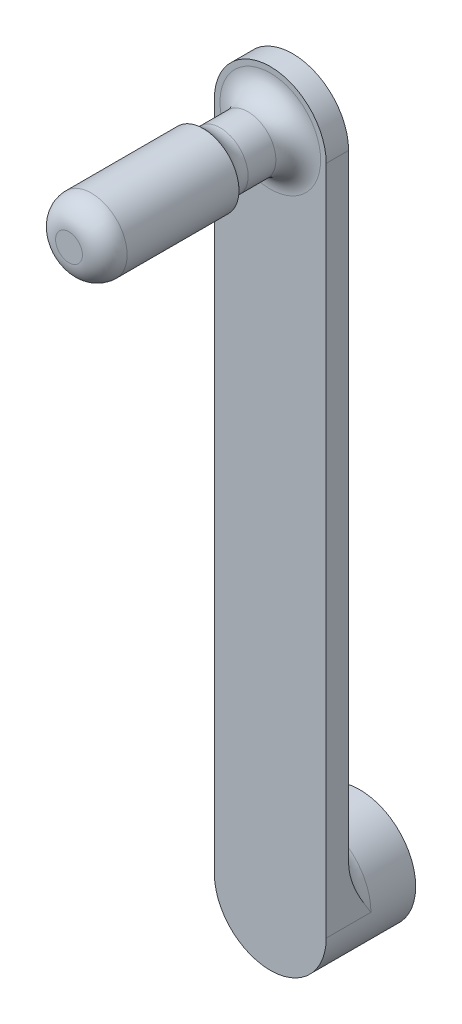
ISO-10303-21;
HEADER;
FILE_DESCRIPTION(('STEP AP214'),'2;1');
FILE_NAME('part.step','',(''),(''),'','','');
FILE_SCHEMA(('AUTOMOTIVE_DESIGN { 1 0 10303 214 1 1 1 1 }'));
ENDSEC;
DATA;
#1=APPLICATION_CONTEXT('core data for automotive mechanical design processes');
#2=APPLICATION_PROTOCOL_DEFINITION('international standard','automotive_design',2000,#1);
#3=PRODUCT_CONTEXT('',#1,'mechanical');
#4=PRODUCT('Part','Part','',(#3));
#5=PRODUCT_RELATED_PRODUCT_CATEGORY('part','',(#4));
#6=PRODUCT_DEFINITION_FORMATION('','',#4);
#7=PRODUCT_DEFINITION_CONTEXT('part definition',#1,'design');
#8=PRODUCT_DEFINITION('design','',#6,#7);
#9=PRODUCT_DEFINITION_SHAPE('','',#8);
#10=(LENGTH_UNIT() NAMED_UNIT(*) SI_UNIT(.MILLI.,.METRE.));
#11=(NAMED_UNIT(*) PLANE_ANGLE_UNIT() SI_UNIT($,.RADIAN.));
#12=(NAMED_UNIT(*) SI_UNIT($,.STERADIAN.) SOLID_ANGLE_UNIT());
#13=UNCERTAINTY_MEASURE_WITH_UNIT(LENGTH_MEASURE(1.E-05),#10,'distance_accuracy_value','');
#14=(GEOMETRIC_REPRESENTATION_CONTEXT(3) GLOBAL_UNCERTAINTY_ASSIGNED_CONTEXT((#13)) GLOBAL_UNIT_ASSIGNED_CONTEXT((#10,
#11,#12)) REPRESENTATION_CONTEXT('',''));
#15=CARTESIAN_POINT('',(0.,0.,0.));
#16=DIRECTION('',(0.,0.,1.));
#17=DIRECTION('',(1.,0.,0.));
#18=AXIS2_PLACEMENT_3D('',#15,#16,#17);
#19=CARTESIAN_POINT('',(0.,0.,-15.));
#20=DIRECTION('',(0.,0.,1.));
#21=DIRECTION('',(1.,0.,0.));
#22=AXIS2_PLACEMENT_3D('',#19,#20,#21);
#23=PLANE('',#22);
#24=CARTESIAN_POINT('',(0.,0.,-15.));
#25=DIRECTION('',(0.,0.,1.));
#26=DIRECTION('',(1.,0.,0.));
#27=AXIS2_PLACEMENT_3D('',#24,#25,#26);
#28=CIRCLE('',#27,25.);
#29=CARTESIAN_POINT('',(25.,0.,-15.));
#30=VERTEX_POINT('',#29);
#31=EDGE_CURVE('E174',#30,#30,#28,.T.);
#32=ORIENTED_EDGE('',*,*,#31,.F.);
#33=EDGE_LOOP('',(#32));
#34=FACE_BOUND('',#33,.T.);
#35=DIRECTION('',(1.,0.,0.));
#36=VECTOR('',#35,1.);
#37=CARTESIAN_POINT('',(5.,19.5,-15.));
#38=LINE('',#37,#36);
#39=CARTESIAN_POINT('',(-5.,19.5,-15.));
#40=VERTEX_POINT('',#39);
#41=CARTESIAN_POINT('',(5.,19.5,-15.));
#42=VERTEX_POINT('',#41);
#43=EDGE_CURVE('E138',#40,#42,#38,.T.);
#44=ORIENTED_EDGE('',*,*,#43,.F.);
#45=DIRECTION('',(0.,1.,0.));
#46=VECTOR('',#45,1.);
#47=CARTESIAN_POINT('',(-5.,19.5,-15.));
#48=LINE('',#47,#46);
#49=CARTESIAN_POINT('',(-5.,14.142135623731,-15.));
#50=VERTEX_POINT('',#49);
#51=EDGE_CURVE('E124',#50,#40,#48,.T.);
#52=ORIENTED_EDGE('',*,*,#51,.F.);
#53=CARTESIAN_POINT('',(0.,0.,-15.));
#54=DIRECTION('',(0.,0.,1.));
#55=DIRECTION('',(1.,0.,0.));
#56=AXIS2_PLACEMENT_3D('',#53,#54,#55);
#57=CIRCLE('',#56,15.);
#58=CARTESIAN_POINT('',(5.,14.142135623731,-15.));
#59=VERTEX_POINT('',#58);
#60=EDGE_CURVE('E171',#50,#59,#57,.T.);
#61=ORIENTED_EDGE('',*,*,#60,.T.);
#62=DIRECTION('',(0.,-1.,0.));
#63=VECTOR('',#62,1.);
#64=CARTESIAN_POINT('',(5.,19.5,-15.));
#65=LINE('',#64,#63);
#66=EDGE_CURVE('E118',#42,#59,#65,.T.);
#67=ORIENTED_EDGE('',*,*,#66,.F.);
#68=EDGE_LOOP('',(#44,#52,#61,#67));
#69=FACE_BOUND('',#68,.T.);
#70=ADVANCED_FACE('F36',(#34,#69),#23,.F.);
#71=CARTESIAN_POINT('',(0.,0.,15.));
#72=DIRECTION('',(0.,0.,-1.));
#73=DIRECTION('',(-1.,0.,0.));
#74=AXIS2_PLACEMENT_3D('',#71,#72,#73);
#75=CYLINDRICAL_SURFACE('',#74,25.);
#76=DIRECTION('',(0.,0.,-1.));
#77=VECTOR('',#76,1.);
#78=CARTESIAN_POINT('',(-25.,0.,25.));
#79=LINE('',#78,#77);
#80=CARTESIAN_POINT('',(-25.,0.,25.));
#81=VERTEX_POINT('',#80);
#82=CARTESIAN_POINT('',(-25.,0.,5.));
#83=VERTEX_POINT('',#82);
#84=EDGE_CURVE('E51',#81,#83,#79,.T.);
#85=ORIENTED_EDGE('',*,*,#84,.T.);
#86=CARTESIAN_POINT('',(0.,0.,5.));
#87=DIRECTION('',(0.,0.,1.));
#88=DIRECTION('',(1.,0.,0.));
#89=AXIS2_PLACEMENT_3D('',#86,#87,#88);
#90=CIRCLE('',#89,25.);
#91=CARTESIAN_POINT('',(25.,0.,5.));
#92=VERTEX_POINT('',#91);
#93=EDGE_CURVE('E186',#83,#92,#90,.F.);
#94=ORIENTED_EDGE('',*,*,#93,.T.);
#95=DIRECTION('',(0.,0.,-1.));
#96=VECTOR('',#95,1.);
#97=CARTESIAN_POINT('',(25.,0.,25.));
#98=LINE('',#97,#96);
#99=CARTESIAN_POINT('',(25.,0.,25.));
#100=VERTEX_POINT('',#99);
#101=EDGE_CURVE('E59',#100,#92,#98,.T.);
#102=ORIENTED_EDGE('',*,*,#101,.F.);
#103=CARTESIAN_POINT('',(0.,0.,25.));
#104=DIRECTION('',(0.,0.,1.));
#105=DIRECTION('',(1.,0.,0.));
#106=AXIS2_PLACEMENT_3D('',#103,#104,#105);
#107=CIRCLE('',#106,25.);
#108=EDGE_CURVE('E150',#81,#100,#107,.T.);
#109=ORIENTED_EDGE('',*,*,#108,.F.);
#110=EDGE_LOOP('',(#85,#94,#102,#109));
#111=FACE_BOUND('',#110,.T.);
#112=ORIENTED_EDGE('',*,*,#31,.T.);
#113=EDGE_LOOP('',(#112));
#114=FACE_BOUND('',#113,.T.);
#115=ADVANCED_FACE('F212',(#111,#114),#75,.T.);
#116=CARTESIAN_POINT('',(0.,0.,15.));
#117=DIRECTION('',(0.,0.,-1.));
#118=DIRECTION('',(-1.,0.,0.));
#119=AXIS2_PLACEMENT_3D('',#116,#117,#118);
#120=CYLINDRICAL_SURFACE('',#119,15.);
#121=DIRECTION('',(0.,0.,-1.));
#122=VECTOR('',#121,1.);
#123=CARTESIAN_POINT('',(-5.,14.142135623731,15.));
#124=LINE('',#123,#122);
#125=CARTESIAN_POINT('',(-5.,14.142135623731,5.));
#126=VERTEX_POINT('',#125);
#127=EDGE_CURVE('E181',#126,#50,#124,.T.);
#128=ORIENTED_EDGE('',*,*,#127,.F.);
#129=CARTESIAN_POINT('',(0.,0.,5.));
#130=DIRECTION('',(0.,0.,-1.));
#131=DIRECTION('',(-1.,0.,0.));
#132=AXIS2_PLACEMENT_3D('',#129,#130,#131);
#133=CIRCLE('',#132,15.);
#134=CARTESIAN_POINT('',(5.,14.142135623731,5.));
#135=VERTEX_POINT('',#134);
#136=EDGE_CURVE('E115',#126,#135,#133,.T.);
#137=ORIENTED_EDGE('',*,*,#136,.T.);
#138=DIRECTION('',(0.,0.,-1.));
#139=VECTOR('',#138,1.);
#140=CARTESIAN_POINT('',(5.,14.142135623731,15.));
#141=LINE('',#140,#139);
#142=EDGE_CURVE('E178',#59,#135,#141,.F.);
#143=ORIENTED_EDGE('',*,*,#142,.F.);
#144=ORIENTED_EDGE('',*,*,#60,.F.);
#145=EDGE_LOOP('',(#128,#137,#143,#144));
#146=FACE_BOUND('',#145,.T.);
#147=CARTESIAN_POINT('',(0.,0.,15.));
#148=DIRECTION('',(0.,0.,1.));
#149=DIRECTION('',(1.,0.,0.));
#150=AXIS2_PLACEMENT_3D('',#147,#148,#149);
#151=CIRCLE('',#150,15.);
#152=CARTESIAN_POINT('',(15.,0.,15.));
#153=VERTEX_POINT('',#152);
#154=EDGE_CURVE('E168',#153,#153,#151,.T.);
#155=ORIENTED_EDGE('',*,*,#154,.T.);
#156=EDGE_LOOP('',(#155));
#157=FACE_BOUND('',#156,.T.);
#158=ADVANCED_FACE('F234',(#146,#157),#120,.F.);
#159=CARTESIAN_POINT('',(0.,300.,15.));
#160=DIRECTION('',(0.,0.,1.));
#161=DIRECTION('',(1.,0.,0.));
#162=AXIS2_PLACEMENT_3D('',#159,#160,#161);
#163=PLANE('',#162);
#164=ORIENTED_EDGE('',*,*,#154,.F.);
#165=EDGE_LOOP('',(#164));
#166=FACE_BOUND('',#165,.T.);
#167=ADVANCED_FACE('F239',(#166),#163,.F.);
#168=DIRECTION('',(0.,1.,0.));
#169=VECTOR('',#168,1.);
#170=CARTESIAN_POINT('',(25.,300.,15.));
#171=LINE('',#170,#169);
#172=CARTESIAN_POINT('',(25.,24.4948974278318,15.));
#173=VERTEX_POINT('',#172);
#174=CARTESIAN_POINT('',(25.,300.,15.));
#175=VERTEX_POINT('',#174);
#176=EDGE_CURVE('E148',#173,#175,#171,.T.);
#177=ORIENTED_EDGE('',*,*,#176,.F.);
#178=CARTESIAN_POINT('',(0.,0.,15.));
#179=DIRECTION('',(0.,0.,1.));
#180=DIRECTION('',(1.,0.,0.));
#181=AXIS2_PLACEMENT_3D('',#178,#179,#180);
#182=CIRCLE('',#181,35.);
#183=CARTESIAN_POINT('',(-25.,24.4948974278318,15.));
#184=VERTEX_POINT('',#183);
#185=EDGE_CURVE('E183',#173,#184,#182,.T.);
#186=ORIENTED_EDGE('',*,*,#185,.T.);
#187=DIRECTION('',(0.,-1.,0.));
#188=VECTOR('',#187,1.);
#189=CARTESIAN_POINT('',(-25.,300.,15.));
#190=LINE('',#189,#188);
#191=CARTESIAN_POINT('',(-25.,300.,15.));
#192=VERTEX_POINT('',#191);
#193=EDGE_CURVE('E157',#192,#184,#190,.T.);
#194=ORIENTED_EDGE('',*,*,#193,.F.);
#195=CARTESIAN_POINT('',(0.,300.,15.));
#196=DIRECTION('',(0.,0.,1.));
#197=DIRECTION('',(1.,0.,0.));
#198=AXIS2_PLACEMENT_3D('',#195,#196,#197);
#199=CIRCLE('',#198,25.);
#200=EDGE_CURVE('E142',#175,#192,#199,.T.);
#201=ORIENTED_EDGE('',*,*,#200,.F.);
#202=EDGE_LOOP('',(#177,#186,#194,#201));
#203=FACE_BOUND('',#202,.T.);
#204=ADVANCED_FACE('F243',(#203),#163,.F.);
#205=CARTESIAN_POINT('',(0.,300.,25.));
#206=DIRECTION('',(0.,0.,-1.));
#207=DIRECTION('',(-1.,0.,0.));
#208=AXIS2_PLACEMENT_3D('',#205,#206,#207);
#209=CYLINDRICAL_SURFACE('',#208,25.);
#210=ORIENTED_EDGE('',*,*,#200,.T.);
#211=DIRECTION('',(0.,0.,-1.));
#212=VECTOR('',#211,1.);
#213=CARTESIAN_POINT('',(-25.,300.,25.));
#214=LINE('',#213,#212);
#215=CARTESIAN_POINT('',(-25.,300.,25.));
#216=VERTEX_POINT('',#215);
#217=EDGE_CURVE('E165',#216,#192,#214,.T.);
#218=ORIENTED_EDGE('',*,*,#217,.F.);
#219=CARTESIAN_POINT('',(0.,300.,25.));
#220=DIRECTION('',(0.,0.,1.));
#221=DIRECTION('',(1.,0.,0.));
#222=AXIS2_PLACEMENT_3D('',#219,#220,#221);
#223=CIRCLE('',#222,25.);
#224=CARTESIAN_POINT('',(25.,300.,25.));
#225=VERTEX_POINT('',#224);
#226=EDGE_CURVE('E144',#225,#216,#223,.T.);
#227=ORIENTED_EDGE('',*,*,#226,.F.);
#228=DIRECTION('',(0.,0.,-1.));
#229=VECTOR('',#228,1.);
#230=CARTESIAN_POINT('',(25.,300.,25.));
#231=LINE('',#230,#229);
#232=EDGE_CURVE('E154',#225,#175,#231,.T.);
#233=ORIENTED_EDGE('',*,*,#232,.T.);
#234=EDGE_LOOP('',(#210,#218,#227,#233));
#235=FACE_BOUND('',#234,.T.);
#236=ADVANCED_FACE('F241',(#235),#209,.T.);
#237=CARTESIAN_POINT('',(-25.,300.,25.));
#238=DIRECTION('',(1.,0.,0.));
#239=DIRECTION('',(0.,1.,0.));
#240=AXIS2_PLACEMENT_3D('',#237,#238,#239);
#241=PLANE('',#240);
#242=ORIENTED_EDGE('',*,*,#193,.T.);
#243=CARTESIAN_POINT('',(-25.,24.4948974278318,15.));
#244=CARTESIAN_POINT('',(-25.,24.1572136642599,14.9999921970734));
#245=CARTESIAN_POINT('',(-25.,23.8196144419104,14.9916231371856));
#246=CARTESIAN_POINT('',(-25.,23.1453072231962,14.959185598783));
#247=CARTESIAN_POINT('',(-25.,22.8085989090153,14.9351237946571));
#248=CARTESIAN_POINT('',(-25.,21.8018856369127,14.8410543239692));
#249=CARTESIAN_POINT('',(-25.,21.1338574530017,14.7491538048115));
#250=CARTESIAN_POINT('',(-25.,19.8176166789862,14.5164114614526));
#251=CARTESIAN_POINT('',(-25.,19.1692579002352,14.37637085872));
#252=CARTESIAN_POINT('',(-25.,17.8831855711075,14.0536558017583));
#253=CARTESIAN_POINT('',(-25.,17.2454745894701,13.8709712146304));
#254=CARTESIAN_POINT('',(-25.,15.8722805982697,13.4341423011457));
#255=CARTESIAN_POINT('',(-25.,15.1390060529384,13.1731005445959));
#256=CARTESIAN_POINT('',(-25.,13.6888543264029,12.6092931042279));
#257=CARTESIAN_POINT('',(-25.,12.9719773531124,12.306526891704));
#258=CARTESIAN_POINT('',(-25.,11.5526935185751,11.6664944363166));
#259=CARTESIAN_POINT('',(-25.,10.8503085391526,11.3291800407121));
#260=CARTESIAN_POINT('',(-25.,9.45940790113112,10.6272834984828));
#261=CARTESIAN_POINT('',(-25.,8.77089207096413,10.2627016894324));
#262=CARTESIAN_POINT('',(-25.,6.71182373610142,9.13139924757018));
#263=CARTESIAN_POINT('',(-25.0000000000001,5.35909462861422,8.33247003207523));
#264=CARTESIAN_POINT('',(-24.9999999999999,2.67980888258523,6.69469108184413));
#265=CARTESIAN_POINT('',(-24.9999999999997,1.35323898074741,5.85586235371641));
#266=CARTESIAN_POINT('',(-25.,0.017817417380386,5.01126872323538));
#267=CARTESIAN_POINT('',(-25.,0.0089087093221101,5.00563436152931));
#268=CARTESIAN_POINT('',(-25.,0.,5.));
#269=B_SPLINE_CURVE_WITH_KNOTS('',3,(#243,#244,#245,#246,#247,#248,#249,#250,#251,#252,#253,
#254,#255,#256,#257,#258,#259,#260,#261,#262,#263,#264,#265,#266,#267,#268),.UNSPECIFIED.,.F.,
.F.,(4,2,2,2,2,2,2,2,2,2,2,2,4),(0.,1.01280703791372,2.02518359257374,4.04564770458662,
6.03399339702986,8.02281203429285,10.3562937950792,12.6898051269784,15.0266143132313,
17.3633945742541,22.0745002027953,26.7831523677138,26.8147751443152),.UNSPECIFIED.);
#270=EDGE_CURVE('E188',#184,#83,#269,.T.);
#271=ORIENTED_EDGE('',*,*,#270,.T.);
#272=ORIENTED_EDGE('',*,*,#84,.F.);
#273=DIRECTION('',(0.,-1.,0.));
#274=VECTOR('',#273,1.);
#275=CARTESIAN_POINT('',(-25.,300.,25.));
#276=LINE('',#275,#274);
#277=EDGE_CURVE('E147',#216,#81,#276,.T.);
#278=ORIENTED_EDGE('',*,*,#277,.F.);
#279=ORIENTED_EDGE('',*,*,#217,.T.);
#280=EDGE_LOOP('',(#242,#271,#272,#278,#279));
#281=FACE_BOUND('',#280,.T.);
#282=ADVANCED_FACE('F203',(#281),#241,.F.);
#283=CARTESIAN_POINT('',(25.,300.,25.));
#284=DIRECTION('',(-1.,0.,0.));
#285=DIRECTION('',(0.,-1.,0.));
#286=AXIS2_PLACEMENT_3D('',#283,#284,#285);
#287=PLANE('',#286);
#288=ORIENTED_EDGE('',*,*,#101,.T.);
#289=CARTESIAN_POINT('',(25.,24.4948974278318,15.));
#290=CARTESIAN_POINT('',(25.,24.1572136642638,14.9999921970734));
#291=CARTESIAN_POINT('',(25.,23.8196144419182,14.9916231371858));
#292=CARTESIAN_POINT('',(25.,23.1453072232118,14.9591855987839));
#293=CARTESIAN_POINT('',(25.,22.8085989090348,14.9351237946586));
#294=CARTESIAN_POINT('',(25.,21.801885636942,14.8410543239726));
#295=CARTESIAN_POINT('',(25.,21.133857453037,14.7491538048166));
#296=CARTESIAN_POINT('',(25.,19.8176166790202,14.5164114614597));
#297=CARTESIAN_POINT('',(25.,19.1692579002623,14.3763708587263));
#298=CARTESIAN_POINT('',(25.,17.8831855711209,14.0536558017621));
#299=CARTESIAN_POINT('',(25.,17.2454745894767,13.8709712146325));
#300=CARTESIAN_POINT('',(25.,15.8722805982687,13.4341423011454));
#301=CARTESIAN_POINT('',(25.,15.1390060529365,13.1731005445951));
#302=CARTESIAN_POINT('',(25.,13.6888543263987,12.6092931042263));
#303=CARTESIAN_POINT('',(25.,12.9719773531068,12.3065268917021));
#304=CARTESIAN_POINT('',(25.,11.5526935185652,11.6664944363116));
#305=CARTESIAN_POINT('',(25.,10.8503085391398,11.3291800407042));
#306=CARTESIAN_POINT('',(25.,9.45940790111023,10.6272834984737));
#307=CARTESIAN_POINT('',(25.,8.77089207093807,10.2627016894249));
#308=CARTESIAN_POINT('',(25.,6.71182373608526,9.13139924754757));
#309=CARTESIAN_POINT('',(25.,5.35909462862901,8.33247003201083));
#310=CARTESIAN_POINT('',(25.,2.67980888254153,6.69469108189087));
#311=CARTESIAN_POINT('',(25.,1.3532389806143,5.85586235391605));
#312=CARTESIAN_POINT('',(25.,0.0178174173788737,5.01126872323822));
#313=CARTESIAN_POINT('',(25.,0.00890870932135182,5.00563436153074));
#314=CARTESIAN_POINT('',(25.,0.,5.));
#315=B_SPLINE_CURVE_WITH_KNOTS('',3,(#289,#290,#291,#292,#293,#294,#295,#296,#297,#298,#299,
#300,#301,#302,#303,#304,#305,#306,#307,#308,#309,#310,#311,#312,#313,#314),.UNSPECIFIED.,.F.,
.F.,(4,2,2,2,2,2,2,2,2,2,2,2,4),(0.,1.01280703790203,2.02518359255031,4.04564770454492,
6.03399339700899,8.02281203429283,10.3562937950823,12.6898051269855,15.0266143132504,
17.3633945742836,22.0745002028133,26.7831523677134,26.8147751443152),.UNSPECIFIED.);
#316=EDGE_CURVE('E196',#92,#173,#315,.F.);
#317=ORIENTED_EDGE('',*,*,#316,.T.);
#318=ORIENTED_EDGE('',*,*,#176,.T.);
#319=ORIENTED_EDGE('',*,*,#232,.F.);
#320=DIRECTION('',(0.,1.,0.));
#321=VECTOR('',#320,1.);
#322=CARTESIAN_POINT('',(25.,300.,25.));
#323=LINE('',#322,#321);
#324=EDGE_CURVE('E152',#100,#225,#323,.T.);
#325=ORIENTED_EDGE('',*,*,#324,.F.);
#326=EDGE_LOOP('',(#288,#317,#318,#319,#325));
#327=FACE_BOUND('',#326,.T.);
#328=ADVANCED_FACE('F249',(#327),#287,.F.);
#329=CARTESIAN_POINT('',(0.,300.,25.));
#330=DIRECTION('',(0.,0.,1.));
#331=DIRECTION('',(1.,0.,0.));
#332=AXIS2_PLACEMENT_3D('',#329,#330,#331);
#333=PLANE('',#332);
#334=CARTESIAN_POINT('',(0.,300.,25.));
#335=DIRECTION('',(0.,0.,1.));
#336=DIRECTION('',(1.,0.,0.));
#337=AXIS2_PLACEMENT_3D('',#334,#335,#336);
#338=CIRCLE('',#337,22.5);
#339=CARTESIAN_POINT('',(22.5,300.,25.));
#340=VERTEX_POINT('',#339);
#341=EDGE_CURVE('E265',#340,#340,#338,.F.);
#342=ORIENTED_EDGE('',*,*,#341,.T.);
#343=EDGE_LOOP('',(#342));
#344=FACE_BOUND('',#343,.T.);
#345=ORIENTED_EDGE('',*,*,#226,.T.);
#346=ORIENTED_EDGE('',*,*,#277,.T.);
#347=ORIENTED_EDGE('',*,*,#108,.T.);
#348=ORIENTED_EDGE('',*,*,#324,.T.);
#349=EDGE_LOOP('',(#345,#346,#347,#348));
#350=FACE_BOUND('',#349,.T.);
#351=ADVANCED_FACE('F260',(#344,#350),#333,.T.);
#352=CARTESIAN_POINT('',(-5.,19.5,5.));
#353=DIRECTION('',(-1.,0.,0.));
#354=DIRECTION('',(0.,-1.,0.));
#355=AXIS2_PLACEMENT_3D('',#352,#353,#354);
#356=PLANE('',#355);
#357=ORIENTED_EDGE('',*,*,#127,.T.);
#358=ORIENTED_EDGE('',*,*,#51,.T.);
#359=DIRECTION('',(0.,0.,-1.));
#360=VECTOR('',#359,1.);
#361=CARTESIAN_POINT('',(-5.,19.5,5.));
#362=LINE('',#361,#360);
#363=CARTESIAN_POINT('',(-5.,19.5,5.));
#364=VERTEX_POINT('',#363);
#365=EDGE_CURVE('E121',#364,#40,#362,.T.);
#366=ORIENTED_EDGE('',*,*,#365,.F.);
#367=DIRECTION('',(0.,1.,0.));
#368=VECTOR('',#367,1.);
#369=CARTESIAN_POINT('',(-5.,19.5,5.));
#370=LINE('',#369,#368);
#371=EDGE_CURVE('E109',#126,#364,#370,.T.);
#372=ORIENTED_EDGE('',*,*,#371,.F.);
#373=EDGE_LOOP('',(#357,#358,#366,#372));
#374=FACE_BOUND('',#373,.T.);
#375=ADVANCED_FACE('F122',(#374),#356,.F.);
#376=CARTESIAN_POINT('',(5.,19.5,5.));
#377=DIRECTION('',(1.,0.,0.));
#378=DIRECTION('',(0.,1.,0.));
#379=AXIS2_PLACEMENT_3D('',#376,#377,#378);
#380=PLANE('',#379);
#381=ORIENTED_EDGE('',*,*,#142,.T.);
#382=DIRECTION('',(0.,-1.,0.));
#383=VECTOR('',#382,1.);
#384=CARTESIAN_POINT('',(5.,19.5,5.));
#385=LINE('',#384,#383);
#386=CARTESIAN_POINT('',(5.,19.5,5.));
#387=VERTEX_POINT('',#386);
#388=EDGE_CURVE('E129',#387,#135,#385,.T.);
#389=ORIENTED_EDGE('',*,*,#388,.F.);
#390=DIRECTION('',(0.,0.,-1.));
#391=VECTOR('',#390,1.);
#392=CARTESIAN_POINT('',(5.,19.5,5.));
#393=LINE('',#392,#391);
#394=EDGE_CURVE('E128',#387,#42,#393,.T.);
#395=ORIENTED_EDGE('',*,*,#394,.T.);
#396=ORIENTED_EDGE('',*,*,#66,.T.);
#397=EDGE_LOOP('',(#381,#389,#395,#396));
#398=FACE_BOUND('',#397,.T.);
#399=ADVANCED_FACE('F296',(#398),#380,.F.);
#400=CARTESIAN_POINT('',(5.,19.5,5.));
#401=DIRECTION('',(0.,1.,0.));
#402=DIRECTION('',(0.,0.,1.));
#403=AXIS2_PLACEMENT_3D('',#400,#401,#402);
#404=PLANE('',#403);
#405=ORIENTED_EDGE('',*,*,#43,.T.);
#406=ORIENTED_EDGE('',*,*,#394,.F.);
#407=DIRECTION('',(1.,0.,0.));
#408=VECTOR('',#407,1.);
#409=CARTESIAN_POINT('',(5.,19.5,5.));
#410=LINE('',#409,#408);
#411=EDGE_CURVE('E113',#364,#387,#410,.T.);
#412=ORIENTED_EDGE('',*,*,#411,.F.);
#413=ORIENTED_EDGE('',*,*,#365,.T.);
#414=EDGE_LOOP('',(#405,#406,#412,#413));
#415=FACE_BOUND('',#414,.T.);
#416=ADVANCED_FACE('F131',(#415),#404,.F.);
#417=CARTESIAN_POINT('',(0.,0.,5.));
#418=DIRECTION('',(0.,0.,-1.));
#419=DIRECTION('',(-1.,0.,0.));
#420=AXIS2_PLACEMENT_3D('',#417,#418,#419);
#421=PLANE('',#420);
#422=ORIENTED_EDGE('',*,*,#371,.T.);
#423=ORIENTED_EDGE('',*,*,#411,.T.);
#424=ORIENTED_EDGE('',*,*,#388,.T.);
#425=ORIENTED_EDGE('',*,*,#136,.F.);
#426=EDGE_LOOP('',(#422,#423,#424,#425));
#427=FACE_BOUND('',#426,.T.);
#428=ADVANCED_FACE('F111',(#427),#421,.T.);
#429=CARTESIAN_POINT('',(0.,0.,5.));
#430=DIRECTION('',(0.,0.,1.));
#431=DIRECTION('',(1.,0.,0.));
#432=AXIS2_PLACEMENT_3D('',#429,#430,#431);
#433=TOROIDAL_SURFACE('',#432,35.,10.);
#434=ORIENTED_EDGE('',*,*,#316,.F.);
#435=ORIENTED_EDGE('',*,*,#93,.F.);
#436=ORIENTED_EDGE('',*,*,#270,.F.);
#437=ORIENTED_EDGE('',*,*,#185,.F.);
#438=EDGE_LOOP('',(#434,#435,#436,#437));
#439=FACE_BOUND('',#438,.T.);
#440=ADVANCED_FACE('F206',(#439),#433,.F.);
#441=CARTESIAN_POINT('',(0.,316.,115.));
#442=DIRECTION('',(0.,0.,1.));
#443=DIRECTION('',(1.,0.,0.));
#444=AXIS2_PLACEMENT_3D('',#441,#442,#443);
#445=PLANE('',#444);
#446=CARTESIAN_POINT('',(0.,300.,115.));
#447=DIRECTION('',(0.,0.,1.));
#448=DIRECTION('',(1.,0.,0.));
#449=AXIS2_PLACEMENT_3D('',#446,#447,#448);
#450=CIRCLE('',#449,6.00000000000001);
#451=CARTESIAN_POINT('',(6.00000000000001,300.,115.));
#452=VERTEX_POINT('',#451);
#453=EDGE_CURVE('E11',#452,#452,#450,.T.);
#454=ORIENTED_EDGE('',*,*,#453,.T.);
#455=EDGE_LOOP('',(#454));
#456=FACE_BOUND('',#455,.T.);
#457=ADVANCED_FACE('F210',(#456),#445,.T.);
#458=CARTESIAN_POINT('',(0.,300.,25.));
#459=DIRECTION('',(0.,0.,-1.));
#460=DIRECTION('',(-1.,0.,0.));
#461=AXIS2_PLACEMENT_3D('',#458,#459,#460);
#462=CYLINDRICAL_SURFACE('',#461,16.);
#463=CARTESIAN_POINT('',(0.,300.,105.));
#464=DIRECTION('',(0.,0.,1.));
#465=DIRECTION('',(1.,0.,0.));
#466=AXIS2_PLACEMENT_3D('',#463,#464,#465);
#467=CIRCLE('',#466,16.);
#468=CARTESIAN_POINT('',(16.,300.,105.));
#469=VERTEX_POINT('',#468);
#470=EDGE_CURVE('E44',#469,#469,#467,.F.);
#471=ORIENTED_EDGE('',*,*,#470,.T.);
#472=EDGE_LOOP('',(#471));
#473=FACE_BOUND('',#472,.T.);
#474=CARTESIAN_POINT('',(0.,300.,54.9999999999999));
#475=DIRECTION('',(0.,0.,-1.));
#476=DIRECTION('',(-1.,0.,0.));
#477=AXIS2_PLACEMENT_3D('',#474,#475,#476);
#478=CIRCLE('',#477,16.);
#479=CARTESIAN_POINT('',(-16.,300.,54.9999999999999));
#480=VERTEX_POINT('',#479);
#481=EDGE_CURVE('E139',#480,#480,#478,.T.);
#482=ORIENTED_EDGE('',*,*,#481,.F.);
#483=EDGE_LOOP('',(#482));
#484=FACE_BOUND('',#483,.T.);
#485=ADVANCED_FACE('F272',(#473,#484),#462,.T.);
#486=CARTESIAN_POINT('',(0.,300.,47.4006579232146));
#487=DIRECTION('',(0.,0.,-1.));
#488=DIRECTION('',(-1.,0.,0.));
#489=AXIS2_PLACEMENT_3D('',#486,#487,#488);
#490=TOROIDAL_SURFACE('',#489,22.5,9.99999999999998);
#491=ORIENTED_EDGE('',*,*,#481,.T.);
#492=EDGE_LOOP('',(#491));
#493=FACE_BOUND('',#492,.T.);
#494=CARTESIAN_POINT('',(0.,300.,47.4006579232146));
#495=DIRECTION('',(0.,0.,-1.));
#496=DIRECTION('',(-1.,0.,0.));
#497=AXIS2_PLACEMENT_3D('',#494,#495,#496);
#498=CIRCLE('',#497,12.5);
#499=CARTESIAN_POINT('',(-12.5,300.,47.4006579232146));
#500=VERTEX_POINT('',#499);
#501=EDGE_CURVE('E280',#500,#500,#498,.T.);
#502=ORIENTED_EDGE('',*,*,#501,.F.);
#503=EDGE_LOOP('',(#502));
#504=FACE_BOUND('',#503,.T.);
#505=ADVANCED_FACE('F224',(#493,#504),#490,.F.);
#506=CARTESIAN_POINT('',(0.,300.,25.));
#507=DIRECTION('',(0.,0.,-1.));
#508=DIRECTION('',(-1.,0.,0.));
#509=AXIS2_PLACEMENT_3D('',#506,#507,#508);
#510=CYLINDRICAL_SURFACE('',#509,12.5);
#511=CARTESIAN_POINT('',(0.,300.,35.));
#512=DIRECTION('',(0.,0.,1.));
#513=DIRECTION('',(1.,0.,0.));
#514=AXIS2_PLACEMENT_3D('',#511,#512,#513);
#515=CIRCLE('',#514,12.5);
#516=CARTESIAN_POINT('',(12.5,300.,35.));
#517=VERTEX_POINT('',#516);
#518=EDGE_CURVE('E263',#517,#517,#515,.T.);
#519=ORIENTED_EDGE('',*,*,#518,.T.);
#520=EDGE_LOOP('',(#519));
#521=FACE_BOUND('',#520,.T.);
#522=ORIENTED_EDGE('',*,*,#501,.T.);
#523=EDGE_LOOP('',(#522));
#524=FACE_BOUND('',#523,.T.);
#525=ADVANCED_FACE('F217',(#521,#524),#510,.T.);
#526=CARTESIAN_POINT('',(0.,300.,35.));
#527=DIRECTION('',(0.,0.,1.));
#528=DIRECTION('',(1.,0.,0.));
#529=AXIS2_PLACEMENT_3D('',#526,#527,#528);
#530=TOROIDAL_SURFACE('',#529,22.5,10.);
#531=ORIENTED_EDGE('',*,*,#341,.F.);
#532=EDGE_LOOP('',(#531));
#533=FACE_BOUND('',#532,.T.);
#534=ORIENTED_EDGE('',*,*,#518,.F.);
#535=EDGE_LOOP('',(#534));
#536=FACE_BOUND('',#535,.T.);
#537=ADVANCED_FACE('F214',(#533,#536),#530,.F.);
#538=CARTESIAN_POINT('',(0.,300.,105.));
#539=DIRECTION('',(0.,0.,1.));
#540=DIRECTION('',(1.,0.,0.));
#541=AXIS2_PLACEMENT_3D('',#538,#539,#540);
#542=DEGENERATE_TOROIDAL_SURFACE('',#541,6.00000000000001,10.,.T.);
#543=ORIENTED_EDGE('',*,*,#453,.F.);
#544=EDGE_LOOP('',(#543));
#545=FACE_BOUND('',#544,.T.);
#546=ORIENTED_EDGE('',*,*,#470,.F.);
#547=EDGE_LOOP('',(#546));
#548=FACE_BOUND('',#547,.T.);
#549=ADVANCED_FACE('F38',(#545,#548),#542,.T.);
#550=CLOSED_SHELL('',(#70,#115,#158,#167,#204,#236,#282,#328,#351,#375,#399,#416,#428,#440,#457,
#485,#505,#525,#537,#549));
#551=MANIFOLD_SOLID_BREP('B2',#550);
#552=ADVANCED_BREP_SHAPE_REPRESENTATION('',(#18,#551),#14);
#553=SHAPE_DEFINITION_REPRESENTATION(#9,#552);
ENDSEC;
END-ISO-10303-21;
